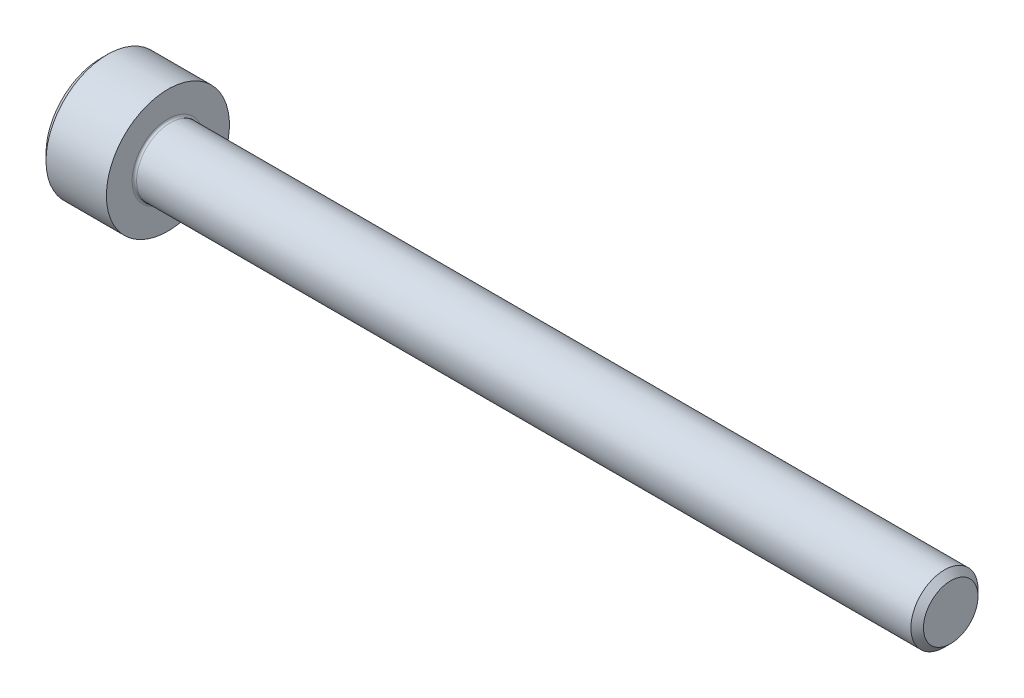
ISO-10303-21;
HEADER;
FILE_DESCRIPTION(('STEP AP214'),'2;1');
FILE_NAME('part.step','',(''),(''),'','','');
FILE_SCHEMA(('AUTOMOTIVE_DESIGN { 1 0 10303 214 1 1 1 1 }'));
ENDSEC;
DATA;
#1=APPLICATION_CONTEXT('core data for automotive mechanical design processes');
#2=APPLICATION_PROTOCOL_DEFINITION('international standard','automotive_design',2000,#1);
#3=PRODUCT_CONTEXT('',#1,'mechanical');
#4=PRODUCT('Part','Part','',(#3));
#5=PRODUCT_RELATED_PRODUCT_CATEGORY('part','',(#4));
#6=PRODUCT_DEFINITION_FORMATION('','',#4);
#7=PRODUCT_DEFINITION_CONTEXT('part definition',#1,'design');
#8=PRODUCT_DEFINITION('design','',#6,#7);
#9=PRODUCT_DEFINITION_SHAPE('','',#8);
#10=(LENGTH_UNIT() NAMED_UNIT(*) SI_UNIT(.MILLI.,.METRE.));
#11=(NAMED_UNIT(*) PLANE_ANGLE_UNIT() SI_UNIT($,.RADIAN.));
#12=(NAMED_UNIT(*) SI_UNIT($,.STERADIAN.) SOLID_ANGLE_UNIT());
#13=UNCERTAINTY_MEASURE_WITH_UNIT(LENGTH_MEASURE(1.E-05),#10,'distance_accuracy_value','');
#14=(GEOMETRIC_REPRESENTATION_CONTEXT(3) GLOBAL_UNCERTAINTY_ASSIGNED_CONTEXT((#13)) GLOBAL_UNIT_ASSIGNED_CONTEXT((#10,
#11,#12)) REPRESENTATION_CONTEXT('',''));
#15=CARTESIAN_POINT('',(0.,0.,0.));
#16=DIRECTION('',(0.,0.,1.));
#17=DIRECTION('',(1.,0.,0.));
#18=AXIS2_PLACEMENT_3D('',#15,#16,#17);
#19=CARTESIAN_POINT('',(1.3,0.,0.));
#20=DIRECTION('',(-1.,0.,0.));
#21=DIRECTION('',(0.,0.,1.));
#22=AXIS2_PLACEMENT_3D('',#19,#20,#21);
#23=PLANE('',#22);
#24=DIRECTION('',(0.,-1.,0.));
#25=VECTOR('',#24,1.);
#26=CARTESIAN_POINT('',(1.3,0.739008344562715,-1.28));
#27=LINE('',#26,#25);
#28=CARTESIAN_POINT('',(1.3,0.739008344562715,-1.28));
#29=VERTEX_POINT('',#28);
#30=CARTESIAN_POINT('',(1.3,0.,-1.28));
#31=VERTEX_POINT('',#30);
#32=EDGE_CURVE('E250',#29,#31,#27,.T.);
#33=ORIENTED_EDGE('',*,*,#32,.T.);
#34=CARTESIAN_POINT('',(1.3,0.,0.));
#35=DIRECTION('',(1.,0.,0.));
#36=DIRECTION('',(0.,0.,-1.));
#37=AXIS2_PLACEMENT_3D('',#34,#35,#36);
#38=CIRCLE('',#37,1.28);
#39=CARTESIAN_POINT('',(1.3,1.10851251684408,-0.640000000000003));
#40=VERTEX_POINT('',#39);
#41=EDGE_CURVE('E50',#31,#40,#38,.T.);
#42=ORIENTED_EDGE('',*,*,#41,.T.);
#43=DIRECTION('',(0.,-0.500000000000002,-0.866025403784437));
#44=VECTOR('',#43,1.);
#45=CARTESIAN_POINT('',(1.3,1.47801668912544,0.));
#46=LINE('',#45,#44);
#47=EDGE_CURVE('E221',#40,#29,#46,.T.);
#48=ORIENTED_EDGE('',*,*,#47,.T.);
#49=EDGE_LOOP('',(#33,#42,#48));
#50=FACE_BOUND('',#49,.T.);
#51=ADVANCED_FACE('F35',(#50),#23,.T.);
#52=CARTESIAN_POINT('',(1.3,1.47801668912544,0.));
#53=VERTEX_POINT('',#52);
#54=EDGE_CURVE('E253',#53,#40,#46,.T.);
#55=ORIENTED_EDGE('',*,*,#54,.T.);
#56=CARTESIAN_POINT('',(1.3,1.10851251684408,0.639999999999997));
#57=VERTEX_POINT('',#56);
#58=EDGE_CURVE('E200',#40,#57,#38,.T.);
#59=ORIENTED_EDGE('',*,*,#58,.T.);
#60=DIRECTION('',(0.,0.499999999999997,-0.86602540378444));
#61=VECTOR('',#60,1.);
#62=CARTESIAN_POINT('',(1.3,0.73900834456272,1.28));
#63=LINE('',#62,#61);
#64=EDGE_CURVE('E237',#57,#53,#63,.T.);
#65=ORIENTED_EDGE('',*,*,#64,.T.);
#66=EDGE_LOOP('',(#55,#59,#65));
#67=FACE_BOUND('',#66,.T.);
#68=ADVANCED_FACE('F125',(#67),#23,.T.);
#69=CARTESIAN_POINT('',(1.3,0.73900834456272,1.28));
#70=VERTEX_POINT('',#69);
#71=EDGE_CURVE('E209',#70,#57,#63,.T.);
#72=ORIENTED_EDGE('',*,*,#71,.T.);
#73=CARTESIAN_POINT('',(1.3,0.,1.28));
#74=VERTEX_POINT('',#73);
#75=EDGE_CURVE('E258',#57,#74,#38,.T.);
#76=ORIENTED_EDGE('',*,*,#75,.T.);
#77=DIRECTION('',(0.,1.,0.));
#78=VECTOR('',#77,1.);
#79=CARTESIAN_POINT('',(1.3,-0.739008344562722,1.28));
#80=LINE('',#79,#78);
#81=EDGE_CURVE('E241',#74,#70,#80,.T.);
#82=ORIENTED_EDGE('',*,*,#81,.T.);
#83=EDGE_LOOP('',(#72,#76,#82));
#84=FACE_BOUND('',#83,.T.);
#85=ADVANCED_FACE('F130',(#84),#23,.T.);
#86=CARTESIAN_POINT('',(1.3,-0.739008344562722,1.28));
#87=VERTEX_POINT('',#86);
#88=EDGE_CURVE('E238',#87,#74,#80,.T.);
#89=ORIENTED_EDGE('',*,*,#88,.T.);
#90=CARTESIAN_POINT('',(1.3,-1.10851251684408,0.640000000000001));
#91=VERTEX_POINT('',#90);
#92=EDGE_CURVE('E262',#74,#91,#38,.T.);
#93=ORIENTED_EDGE('',*,*,#92,.T.);
#94=DIRECTION('',(0.,0.500000000000001,0.866025403784438));
#95=VECTOR('',#94,1.);
#96=CARTESIAN_POINT('',(1.3,-1.47801668912544,0.));
#97=LINE('',#96,#95);
#98=EDGE_CURVE('E245',#91,#87,#97,.T.);
#99=ORIENTED_EDGE('',*,*,#98,.T.);
#100=EDGE_LOOP('',(#89,#93,#99));
#101=FACE_BOUND('',#100,.T.);
#102=ADVANCED_FACE('F274',(#101),#23,.T.);
#103=CARTESIAN_POINT('',(1.3,-1.47801668912544,0.));
#104=VERTEX_POINT('',#103);
#105=EDGE_CURVE('E242',#104,#91,#97,.T.);
#106=ORIENTED_EDGE('',*,*,#105,.T.);
#107=CARTESIAN_POINT('',(1.3,-1.10851251684408,-0.639999999999998));
#108=VERTEX_POINT('',#107);
#109=EDGE_CURVE('E259',#91,#108,#38,.T.);
#110=ORIENTED_EDGE('',*,*,#109,.T.);
#111=DIRECTION('',(0.,-0.499999999999998,0.86602540378444));
#112=VECTOR('',#111,1.);
#113=CARTESIAN_POINT('',(1.3,-0.739008344562726,-1.28));
#114=LINE('',#113,#112);
#115=EDGE_CURVE('E249',#108,#104,#114,.T.);
#116=ORIENTED_EDGE('',*,*,#115,.T.);
#117=EDGE_LOOP('',(#106,#110,#116));
#118=FACE_BOUND('',#117,.T.);
#119=ADVANCED_FACE('F123',(#118),#23,.T.);
#120=CARTESIAN_POINT('',(0.,0.,0.));
#121=DIRECTION('',(1.,0.,0.));
#122=DIRECTION('',(0.,0.,-1.));
#123=AXIS2_PLACEMENT_3D('',#120,#121,#122);
#124=CYLINDRICAL_SURFACE('',#123,2.75);
#125=CARTESIAN_POINT('',(0.299999999999993,0.,0.));
#126=DIRECTION('',(-1.,0.,0.));
#127=DIRECTION('',(0.,0.,1.));
#128=AXIS2_PLACEMENT_3D('',#125,#126,#127);
#129=CIRCLE('',#128,2.75);
#130=CARTESIAN_POINT('',(0.299999999999993,0.,2.75));
#131=VERTEX_POINT('',#130);
#132=EDGE_CURVE('E187',#131,#131,#129,.F.);
#133=ORIENTED_EDGE('',*,*,#132,.T.);
#134=EDGE_LOOP('',(#133));
#135=FACE_BOUND('',#134,.T.);
#136=CARTESIAN_POINT('',(3.,0.,0.));
#137=DIRECTION('',(1.,0.,0.));
#138=DIRECTION('',(0.,0.,1.));
#139=AXIS2_PLACEMENT_3D('',#136,#137,#138);
#140=CIRCLE('',#139,2.75);
#141=CARTESIAN_POINT('',(3.,0.,2.75));
#142=VERTEX_POINT('',#141);
#143=EDGE_CURVE('E201',#142,#142,#140,.T.);
#144=ORIENTED_EDGE('',*,*,#143,.F.);
#145=EDGE_LOOP('',(#144));
#146=FACE_BOUND('',#145,.T.);
#147=ADVANCED_FACE('F168',(#135,#146),#124,.T.);
#148=CARTESIAN_POINT('',(0.,0.,0.));
#149=DIRECTION('',(-1.,0.,0.));
#150=DIRECTION('',(0.,0.,1.));
#151=AXIS2_PLACEMENT_3D('',#148,#149,#150);
#152=PLANE('',#151);
#153=CARTESIAN_POINT('',(0.,0.,0.));
#154=DIRECTION('',(-1.,0.,0.));
#155=DIRECTION('',(0.,0.,1.));
#156=AXIS2_PLACEMENT_3D('',#153,#154,#155);
#157=CIRCLE('',#156,2.45000000000001);
#158=CARTESIAN_POINT('',(0.,0.,2.45000000000001));
#159=VERTEX_POINT('',#158);
#160=EDGE_CURVE('E184',#159,#159,#157,.T.);
#161=ORIENTED_EDGE('',*,*,#160,.T.);
#162=EDGE_LOOP('',(#161));
#163=FACE_BOUND('',#162,.T.);
#164=DIRECTION('',(0.,-0.500000000000002,-0.866025403784437));
#165=VECTOR('',#164,1.);
#166=CARTESIAN_POINT('',(0.,1.47801668912544,0.));
#167=LINE('',#166,#165);
#168=CARTESIAN_POINT('',(0.,1.47801668912544,0.));
#169=VERTEX_POINT('',#168);
#170=CARTESIAN_POINT('',(0.,0.739008344562715,-1.28));
#171=VERTEX_POINT('',#170);
#172=EDGE_CURVE('E58',#169,#171,#167,.T.);
#173=ORIENTED_EDGE('',*,*,#172,.F.);
#174=DIRECTION('',(0.,0.499999999999997,-0.86602540378444));
#175=VECTOR('',#174,1.);
#176=CARTESIAN_POINT('',(0.,0.73900834456272,1.28));
#177=LINE('',#176,#175);
#178=CARTESIAN_POINT('',(0.,0.73900834456272,1.28));
#179=VERTEX_POINT('',#178);
#180=EDGE_CURVE('E218',#179,#169,#177,.T.);
#181=ORIENTED_EDGE('',*,*,#180,.F.);
#182=DIRECTION('',(0.,1.,0.));
#183=VECTOR('',#182,1.);
#184=CARTESIAN_POINT('',(0.,-0.739008344562722,1.28));
#185=LINE('',#184,#183);
#186=CARTESIAN_POINT('',(0.,-0.739008344562722,1.28));
#187=VERTEX_POINT('',#186);
#188=EDGE_CURVE('E222',#187,#179,#185,.T.);
#189=ORIENTED_EDGE('',*,*,#188,.F.);
#190=DIRECTION('',(0.,0.500000000000001,0.866025403784438));
#191=VECTOR('',#190,1.);
#192=CARTESIAN_POINT('',(0.,-1.47801668912544,0.));
#193=LINE('',#192,#191);
#194=CARTESIAN_POINT('',(0.,-1.47801668912544,0.));
#195=VERTEX_POINT('',#194);
#196=EDGE_CURVE('E225',#195,#187,#193,.T.);
#197=ORIENTED_EDGE('',*,*,#196,.F.);
#198=DIRECTION('',(0.,-0.499999999999998,0.86602540378444));
#199=VECTOR('',#198,1.);
#200=CARTESIAN_POINT('',(0.,-0.739008344562726,-1.28));
#201=LINE('',#200,#199);
#202=CARTESIAN_POINT('',(0.,-0.739008344562726,-1.28));
#203=VERTEX_POINT('',#202);
#204=EDGE_CURVE('E228',#203,#195,#201,.T.);
#205=ORIENTED_EDGE('',*,*,#204,.F.);
#206=DIRECTION('',(0.,-1.,0.));
#207=VECTOR('',#206,1.);
#208=CARTESIAN_POINT('',(0.,0.739008344562715,-1.28));
#209=LINE('',#208,#207);
#210=EDGE_CURVE('E231',#171,#203,#209,.T.);
#211=ORIENTED_EDGE('',*,*,#210,.F.);
#212=EDGE_LOOP('',(#173,#181,#189,#197,#205,#211));
#213=FACE_BOUND('',#212,.T.);
#214=ADVANCED_FACE('F165',(#163,#213),#152,.T.);
#215=CARTESIAN_POINT('',(3.,0.,0.));
#216=DIRECTION('',(-1.,0.,0.));
#217=DIRECTION('',(0.,0.,1.));
#218=AXIS2_PLACEMENT_3D('',#215,#216,#217);
#219=PLANE('',#218);
#220=CARTESIAN_POINT('',(3.,0.,0.));
#221=DIRECTION('',(-1.,0.,0.));
#222=DIRECTION('',(0.,0.,1.));
#223=AXIS2_PLACEMENT_3D('',#220,#221,#222);
#224=CIRCLE('',#223,1.6);
#225=CARTESIAN_POINT('',(3.,0.,1.6));
#226=VERTEX_POINT('',#225);
#227=EDGE_CURVE('E188',#226,#226,#224,.T.);
#228=ORIENTED_EDGE('',*,*,#227,.T.);
#229=EDGE_LOOP('',(#228));
#230=FACE_BOUND('',#229,.T.);
#231=ORIENTED_EDGE('',*,*,#143,.T.);
#232=EDGE_LOOP('',(#231));
#233=FACE_BOUND('',#232,.T.);
#234=ADVANCED_FACE('F163',(#230,#233),#219,.F.);
#235=CARTESIAN_POINT('',(38.,0.,0.));
#236=DIRECTION('',(-1.,0.,0.));
#237=DIRECTION('',(0.,0.,1.));
#238=AXIS2_PLACEMENT_3D('',#235,#236,#237);
#239=CYLINDRICAL_SURFACE('',#238,1.5);
#240=CARTESIAN_POINT('',(37.7195,0.,0.));
#241=DIRECTION('',(1.,0.,0.));
#242=DIRECTION('',(0.,0.,-1.));
#243=AXIS2_PLACEMENT_3D('',#240,#241,#242);
#244=CIRCLE('',#243,1.5);
#245=CARTESIAN_POINT('',(37.7195,0.,-1.5));
#246=VERTEX_POINT('',#245);
#247=EDGE_CURVE('E11',#246,#246,#244,.F.);
#248=ORIENTED_EDGE('',*,*,#247,.T.);
#249=EDGE_LOOP('',(#248));
#250=FACE_BOUND('',#249,.T.);
#251=CARTESIAN_POINT('',(3.1,0.,0.));
#252=DIRECTION('',(-1.,0.,0.));
#253=DIRECTION('',(0.,0.,1.));
#254=AXIS2_PLACEMENT_3D('',#251,#252,#253);
#255=CIRCLE('',#254,1.5);
#256=CARTESIAN_POINT('',(3.1,0.,1.5));
#257=VERTEX_POINT('',#256);
#258=EDGE_CURVE('E192',#257,#257,#255,.F.);
#259=ORIENTED_EDGE('',*,*,#258,.T.);
#260=EDGE_LOOP('',(#259));
#261=FACE_BOUND('',#260,.T.);
#262=ADVANCED_FACE('F159',(#250,#261),#239,.T.);
#263=CARTESIAN_POINT('',(38.,0.,0.));
#264=DIRECTION('',(1.,0.,0.));
#265=DIRECTION('',(0.,0.,-1.));
#266=AXIS2_PLACEMENT_3D('',#263,#264,#265);
#267=PLANE('',#266);
#268=CARTESIAN_POINT('',(38.,0.,0.));
#269=DIRECTION('',(1.,0.,0.));
#270=DIRECTION('',(0.,0.,-1.));
#271=AXIS2_PLACEMENT_3D('',#268,#269,#270);
#272=CIRCLE('',#271,1.21949999999999);
#273=CARTESIAN_POINT('',(38.,0.,-1.21949999999999));
#274=VERTEX_POINT('',#273);
#275=EDGE_CURVE('E43',#274,#274,#272,.T.);
#276=ORIENTED_EDGE('',*,*,#275,.T.);
#277=EDGE_LOOP('',(#276));
#278=FACE_BOUND('',#277,.T.);
#279=ADVANCED_FACE('F156',(#278),#267,.T.);
#280=CARTESIAN_POINT('',(1.3,1.47801668912544,0.));
#281=DIRECTION('',(0.,0.866025403784437,-0.500000000000002));
#282=DIRECTION('',(0.,0.500000000000002,0.866025403784437));
#283=AXIS2_PLACEMENT_3D('',#280,#281,#282);
#284=PLANE('',#283);
#285=ORIENTED_EDGE('',*,*,#172,.T.);
#286=DIRECTION('',(-1.,0.,0.));
#287=VECTOR('',#286,1.);
#288=CARTESIAN_POINT('',(1.3,0.739008344562715,-1.28));
#289=LINE('',#288,#287);
#290=EDGE_CURVE('E206',#29,#171,#289,.T.);
#291=ORIENTED_EDGE('',*,*,#290,.F.);
#292=ORIENTED_EDGE('',*,*,#47,.F.);
#293=ORIENTED_EDGE('',*,*,#54,.F.);
#294=DIRECTION('',(-1.,0.,0.));
#295=VECTOR('',#294,1.);
#296=CARTESIAN_POINT('',(1.3,1.47801668912544,0.));
#297=LINE('',#296,#295);
#298=EDGE_CURVE('E205',#53,#169,#297,.T.);
#299=ORIENTED_EDGE('',*,*,#298,.T.);
#300=EDGE_LOOP('',(#285,#291,#292,#293,#299));
#301=FACE_BOUND('',#300,.T.);
#302=ADVANCED_FACE('F138',(#301),#284,.F.);
#303=CARTESIAN_POINT('',(1.3,0.73900834456272,1.28));
#304=DIRECTION('',(0.,0.86602540378444,0.499999999999997));
#305=DIRECTION('',(0.,-0.499999999999997,0.86602540378444));
#306=AXIS2_PLACEMENT_3D('',#303,#304,#305);
#307=PLANE('',#306);
#308=ORIENTED_EDGE('',*,*,#180,.T.);
#309=ORIENTED_EDGE('',*,*,#298,.F.);
#310=ORIENTED_EDGE('',*,*,#64,.F.);
#311=ORIENTED_EDGE('',*,*,#71,.F.);
#312=DIRECTION('',(-1.,0.,0.));
#313=VECTOR('',#312,1.);
#314=CARTESIAN_POINT('',(1.3,0.73900834456272,1.28));
#315=LINE('',#314,#313);
#316=EDGE_CURVE('E215',#70,#179,#315,.T.);
#317=ORIENTED_EDGE('',*,*,#316,.T.);
#318=EDGE_LOOP('',(#308,#309,#310,#311,#317));
#319=FACE_BOUND('',#318,.T.);
#320=ADVANCED_FACE('F134',(#319),#307,.F.);
#321=CARTESIAN_POINT('',(1.3,-0.739008344562722,1.28));
#322=DIRECTION('',(0.,0.,1.));
#323=DIRECTION('',(1.,0.,0.));
#324=AXIS2_PLACEMENT_3D('',#321,#322,#323);
#325=PLANE('',#324);
#326=ORIENTED_EDGE('',*,*,#188,.T.);
#327=ORIENTED_EDGE('',*,*,#316,.F.);
#328=ORIENTED_EDGE('',*,*,#81,.F.);
#329=ORIENTED_EDGE('',*,*,#88,.F.);
#330=DIRECTION('',(-1.,0.,0.));
#331=VECTOR('',#330,1.);
#332=CARTESIAN_POINT('',(1.3,-0.739008344562722,1.28));
#333=LINE('',#332,#331);
#334=EDGE_CURVE('E213',#87,#187,#333,.T.);
#335=ORIENTED_EDGE('',*,*,#334,.T.);
#336=EDGE_LOOP('',(#326,#327,#328,#329,#335));
#337=FACE_BOUND('',#336,.T.);
#338=ADVANCED_FACE('F137',(#337),#325,.F.);
#339=CARTESIAN_POINT('',(1.3,-1.47801668912544,0.));
#340=DIRECTION('',(0.,-0.866025403784438,0.500000000000001));
#341=DIRECTION('',(0.,-0.500000000000001,-0.866025403784438));
#342=AXIS2_PLACEMENT_3D('',#339,#340,#341);
#343=PLANE('',#342);
#344=ORIENTED_EDGE('',*,*,#196,.T.);
#345=ORIENTED_EDGE('',*,*,#334,.F.);
#346=ORIENTED_EDGE('',*,*,#98,.F.);
#347=ORIENTED_EDGE('',*,*,#105,.F.);
#348=DIRECTION('',(-1.,0.,0.));
#349=VECTOR('',#348,1.);
#350=CARTESIAN_POINT('',(1.3,-1.47801668912544,0.));
#351=LINE('',#350,#349);
#352=EDGE_CURVE('E211',#104,#195,#351,.T.);
#353=ORIENTED_EDGE('',*,*,#352,.T.);
#354=EDGE_LOOP('',(#344,#345,#346,#347,#353));
#355=FACE_BOUND('',#354,.T.);
#356=ADVANCED_FACE('F142',(#355),#343,.F.);
#357=CARTESIAN_POINT('',(1.3,-0.739008344562726,-1.28));
#358=DIRECTION('',(0.,-0.86602540378444,-0.499999999999998));
#359=DIRECTION('',(0.,0.499999999999998,-0.86602540378444));
#360=AXIS2_PLACEMENT_3D('',#357,#358,#359);
#361=PLANE('',#360);
#362=ORIENTED_EDGE('',*,*,#204,.T.);
#363=ORIENTED_EDGE('',*,*,#352,.F.);
#364=ORIENTED_EDGE('',*,*,#115,.F.);
#365=CARTESIAN_POINT('',(1.3,-0.739008344562726,-1.28));
#366=VERTEX_POINT('',#365);
#367=EDGE_CURVE('E246',#366,#108,#114,.T.);
#368=ORIENTED_EDGE('',*,*,#367,.F.);
#369=DIRECTION('',(-1.,0.,0.));
#370=VECTOR('',#369,1.);
#371=CARTESIAN_POINT('',(1.3,-0.739008344562726,-1.28));
#372=LINE('',#371,#370);
#373=EDGE_CURVE('E208',#366,#203,#372,.T.);
#374=ORIENTED_EDGE('',*,*,#373,.T.);
#375=EDGE_LOOP('',(#362,#363,#364,#368,#374));
#376=FACE_BOUND('',#375,.T.);
#377=ADVANCED_FACE('F146',(#376),#361,.F.);
#378=CARTESIAN_POINT('',(1.3,0.739008344562715,-1.28));
#379=DIRECTION('',(0.,0.,-1.));
#380=DIRECTION('',(-1.,0.,0.));
#381=AXIS2_PLACEMENT_3D('',#378,#379,#380);
#382=PLANE('',#381);
#383=ORIENTED_EDGE('',*,*,#210,.T.);
#384=ORIENTED_EDGE('',*,*,#373,.F.);
#385=EDGE_CURVE('E252',#31,#366,#27,.T.);
#386=ORIENTED_EDGE('',*,*,#385,.F.);
#387=ORIENTED_EDGE('',*,*,#32,.F.);
#388=ORIENTED_EDGE('',*,*,#290,.T.);
#389=EDGE_LOOP('',(#383,#384,#386,#387,#388));
#390=FACE_BOUND('',#389,.T.);
#391=ADVANCED_FACE('F120',(#390),#382,.F.);
#392=ORIENTED_EDGE('',*,*,#367,.T.);
#393=EDGE_CURVE('E204',#108,#31,#38,.T.);
#394=ORIENTED_EDGE('',*,*,#393,.T.);
#395=ORIENTED_EDGE('',*,*,#385,.T.);
#396=EDGE_LOOP('',(#392,#394,#395));
#397=FACE_BOUND('',#396,.T.);
#398=ADVANCED_FACE('F111',(#397),#23,.T.);
#399=CARTESIAN_POINT('',(2.03900834456272,0.,0.));
#400=DIRECTION('',(-1.,0.,0.));
#401=DIRECTION('',(0.,0.,1.));
#402=AXIS2_PLACEMENT_3D('',#399,#400,#401);
#403=CONICAL_SURFACE('',#402,0.,1.0471975511966);
#404=ORIENTED_EDGE('',*,*,#41,.F.);
#405=ORIENTED_EDGE('',*,*,#393,.F.);
#406=ORIENTED_EDGE('',*,*,#109,.F.);
#407=ORIENTED_EDGE('',*,*,#92,.F.);
#408=ORIENTED_EDGE('',*,*,#75,.F.);
#409=ORIENTED_EDGE('',*,*,#58,.F.);
#410=EDGE_LOOP('',(#404,#405,#406,#407,#408,#409));
#411=FACE_BOUND('',#410,.T.);
#412=CARTESIAN_POINT('',(2.03900834456272,0.,0.));
#413=VERTEX_POINT('',#412);
#414=VERTEX_LOOP('',#413);
#415=FACE_BOUND('',#414,.T.);
#416=ADVANCED_FACE('F108',(#411,#415),#403,.F.);
#417=CARTESIAN_POINT('',(3.1,0.,0.));
#418=DIRECTION('',(-1.,0.,0.));
#419=DIRECTION('',(0.,0.,1.));
#420=AXIS2_PLACEMENT_3D('',#417,#418,#419);
#421=TOROIDAL_SURFACE('',#420,1.6,0.1);
#422=ORIENTED_EDGE('',*,*,#227,.F.);
#423=EDGE_LOOP('',(#422));
#424=FACE_BOUND('',#423,.T.);
#425=ORIENTED_EDGE('',*,*,#258,.F.);
#426=EDGE_LOOP('',(#425));
#427=FACE_BOUND('',#426,.T.);
#428=ADVANCED_FACE('F110',(#424,#427),#421,.F.);
#429=CARTESIAN_POINT('',(0.299999999999993,0.,0.));
#430=DIRECTION('',(1.,0.,0.));
#431=DIRECTION('',(0.,0.,-1.));
#432=AXIS2_PLACEMENT_3D('',#429,#430,#431);
#433=CONICAL_SURFACE('',#432,2.75,0.785398163397442);
#434=ORIENTED_EDGE('',*,*,#160,.F.);
#435=EDGE_LOOP('',(#434));
#436=FACE_BOUND('',#435,.T.);
#437=ORIENTED_EDGE('',*,*,#132,.F.);
#438=EDGE_LOOP('',(#437));
#439=FACE_BOUND('',#438,.T.);
#440=ADVANCED_FACE('F117',(#436,#439),#433,.T.);
#441=CARTESIAN_POINT('',(38.,0.,0.));
#442=DIRECTION('',(-1.,0.,0.));
#443=DIRECTION('',(0.,0.,1.));
#444=AXIS2_PLACEMENT_3D('',#441,#442,#443);
#445=CONICAL_SURFACE('',#444,1.21949999999999,0.78539816339749);
#446=ORIENTED_EDGE('',*,*,#247,.F.);
#447=EDGE_LOOP('',(#446));
#448=FACE_BOUND('',#447,.T.);
#449=ORIENTED_EDGE('',*,*,#275,.F.);
#450=EDGE_LOOP('',(#449));
#451=FACE_BOUND('',#450,.T.);
#452=ADVANCED_FACE('F37',(#448,#451),#445,.T.);
#453=CLOSED_SHELL('',(#51,#68,#85,#102,#119,#147,#214,#234,#262,#279,#302,#320,#338,#356,#377,
#391,#398,#416,#428,#440,#452));
#454=MANIFOLD_SOLID_BREP('B2',#453);
#455=ADVANCED_BREP_SHAPE_REPRESENTATION('',(#18,#454),#14);
#456=SHAPE_DEFINITION_REPRESENTATION(#9,#455);
ENDSEC;
END-ISO-10303-21;
